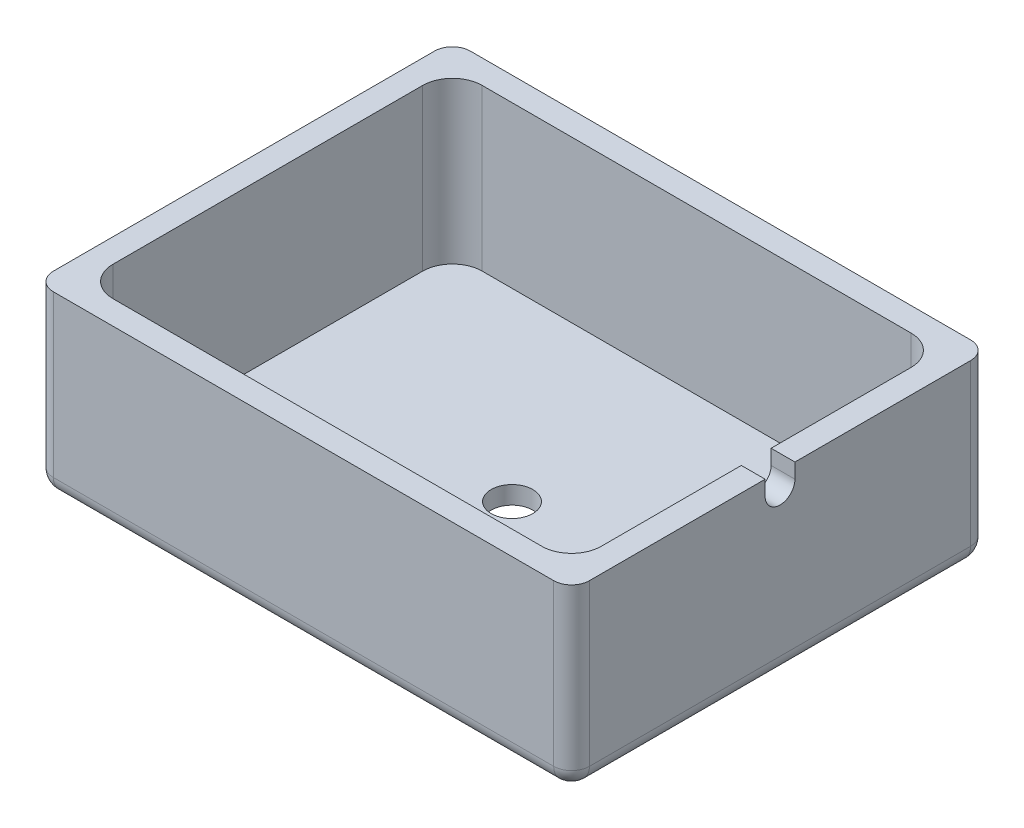
ISO-10303-21;
HEADER;
FILE_DESCRIPTION(('STEP AP214'),'2;1');
FILE_NAME('part.step','',(''),(''),'','','');
FILE_SCHEMA(('AUTOMOTIVE_DESIGN { 1 0 10303 214 1 1 1 1 }'));
ENDSEC;
DATA;
#1=APPLICATION_CONTEXT('core data for automotive mechanical design processes');
#2=APPLICATION_PROTOCOL_DEFINITION('international standard','automotive_design',2000,#1);
#3=PRODUCT_CONTEXT('',#1,'mechanical');
#4=PRODUCT('Part','Part','',(#3));
#5=PRODUCT_RELATED_PRODUCT_CATEGORY('part','',(#4));
#6=PRODUCT_DEFINITION_FORMATION('','',#4);
#7=PRODUCT_DEFINITION_CONTEXT('part definition',#1,'design');
#8=PRODUCT_DEFINITION('design','',#6,#7);
#9=PRODUCT_DEFINITION_SHAPE('','',#8);
#10=(LENGTH_UNIT() NAMED_UNIT(*) SI_UNIT(.MILLI.,.METRE.));
#11=(NAMED_UNIT(*) PLANE_ANGLE_UNIT() SI_UNIT($,.RADIAN.));
#12=(NAMED_UNIT(*) SI_UNIT($,.STERADIAN.) SOLID_ANGLE_UNIT());
#13=UNCERTAINTY_MEASURE_WITH_UNIT(LENGTH_MEASURE(1.E-05),#10,'distance_accuracy_value','');
#14=(GEOMETRIC_REPRESENTATION_CONTEXT(3) GLOBAL_UNCERTAINTY_ASSIGNED_CONTEXT((#13)) GLOBAL_UNIT_ASSIGNED_CONTEXT((#10,
#11,#12)) REPRESENTATION_CONTEXT('',''));
#15=CARTESIAN_POINT('',(0.,0.,0.));
#16=DIRECTION('',(0.,0.,1.));
#17=DIRECTION('',(1.,0.,0.));
#18=AXIS2_PLACEMENT_3D('',#15,#16,#17);
#19=CARTESIAN_POINT('',(45.,3.,0.));
#20=DIRECTION('',(1.,0.,0.));
#21=DIRECTION('',(0.,0.,-1.));
#22=AXIS2_PLACEMENT_3D('',#19,#20,#21);
#23=PLANE('',#22);
#24=DIRECTION('',(0.,1.,0.));
#25=VECTOR('',#24,1.);
#26=CARTESIAN_POINT('',(45.,30.,-2.50000000000001));
#27=LINE('',#26,#25);
#28=CARTESIAN_POINT('',(45.,27.5,-2.50000000000001));
#29=VERTEX_POINT('',#28);
#30=CARTESIAN_POINT('',(45.,30.,-2.50000000000001));
#31=VERTEX_POINT('',#30);
#32=EDGE_CURVE('E217',#29,#31,#27,.T.);
#33=ORIENTED_EDGE('',*,*,#32,.F.);
#34=CARTESIAN_POINT('',(45.,27.5,0.));
#35=DIRECTION('',(1.,0.,0.));
#36=DIRECTION('',(0.,0.,-1.));
#37=AXIS2_PLACEMENT_3D('',#34,#35,#36);
#38=CIRCLE('',#37,2.5);
#39=CARTESIAN_POINT('',(45.,27.5,2.49999999999999));
#40=VERTEX_POINT('',#39);
#41=EDGE_CURVE('E193',#40,#29,#38,.T.);
#42=ORIENTED_EDGE('',*,*,#41,.F.);
#43=DIRECTION('',(0.,-1.,0.));
#44=VECTOR('',#43,1.);
#45=CARTESIAN_POINT('',(45.,27.5,2.49999999999999));
#46=LINE('',#45,#44);
#47=CARTESIAN_POINT('',(45.,30.,2.49999999999999));
#48=VERTEX_POINT('',#47);
#49=EDGE_CURVE('E197',#48,#40,#46,.T.);
#50=ORIENTED_EDGE('',*,*,#49,.F.);
#51=DIRECTION('',(0.,0.,1.));
#52=VECTOR('',#51,1.);
#53=CARTESIAN_POINT('',(45.,30.,0.));
#54=LINE('',#53,#52);
#55=CARTESIAN_POINT('',(45.,30.,32.));
#56=VERTEX_POINT('',#55);
#57=EDGE_CURVE('E229',#48,#56,#54,.T.);
#58=ORIENTED_EDGE('',*,*,#57,.T.);
#59=DIRECTION('',(0.,-1.,0.));
#60=VECTOR('',#59,1.);
#61=CARTESIAN_POINT('',(45.,0.,32.));
#62=LINE('',#61,#60);
#63=CARTESIAN_POINT('',(45.,3.,32.));
#64=VERTEX_POINT('',#63);
#65=EDGE_CURVE('E271',#56,#64,#62,.T.);
#66=ORIENTED_EDGE('',*,*,#65,.T.);
#67=DIRECTION('',(0.,0.,1.));
#68=VECTOR('',#67,1.);
#69=CARTESIAN_POINT('',(45.,3.,-35.));
#70=LINE('',#69,#68);
#71=CARTESIAN_POINT('',(45.,3.,-32.));
#72=VERTEX_POINT('',#71);
#73=EDGE_CURVE('E265',#64,#72,#70,.F.);
#74=ORIENTED_EDGE('',*,*,#73,.T.);
#75=DIRECTION('',(0.,-1.,0.));
#76=VECTOR('',#75,1.);
#77=CARTESIAN_POINT('',(45.,3.,-32.));
#78=LINE('',#77,#76);
#79=CARTESIAN_POINT('',(45.,30.,-32.));
#80=VERTEX_POINT('',#79);
#81=EDGE_CURVE('E269',#72,#80,#78,.F.);
#82=ORIENTED_EDGE('',*,*,#81,.T.);
#83=EDGE_CURVE('E225',#80,#31,#54,.T.);
#84=ORIENTED_EDGE('',*,*,#83,.T.);
#85=EDGE_LOOP('',(#33,#42,#50,#58,#66,#74,#82,#84));
#86=FACE_BOUND('',#85,.T.);
#87=ADVANCED_FACE('F37',(#86),#23,.T.);
#88=CARTESIAN_POINT('',(0.,3.,-35.));
#89=DIRECTION('',(0.,0.,-1.));
#90=DIRECTION('',(-1.,0.,0.));
#91=AXIS2_PLACEMENT_3D('',#88,#89,#90);
#92=PLANE('',#91);
#93=DIRECTION('',(1.,0.,0.));
#94=VECTOR('',#93,1.);
#95=CARTESIAN_POINT('',(0.,30.,-35.));
#96=LINE('',#95,#94);
#97=CARTESIAN_POINT('',(-42.,30.,-35.));
#98=VERTEX_POINT('',#97);
#99=CARTESIAN_POINT('',(42.,30.,-35.));
#100=VERTEX_POINT('',#99);
#101=EDGE_CURVE('E228',#98,#100,#96,.T.);
#102=ORIENTED_EDGE('',*,*,#101,.T.);
#103=DIRECTION('',(0.,-1.,0.));
#104=VECTOR('',#103,1.);
#105=CARTESIAN_POINT('',(42.,3.,-35.));
#106=LINE('',#105,#104);
#107=CARTESIAN_POINT('',(42.,3.,-35.));
#108=VERTEX_POINT('',#107);
#109=EDGE_CURVE('E293',#100,#108,#106,.T.);
#110=ORIENTED_EDGE('',*,*,#109,.T.);
#111=DIRECTION('',(1.,0.,0.));
#112=VECTOR('',#111,1.);
#113=CARTESIAN_POINT('',(-45.,3.,-35.));
#114=LINE('',#113,#112);
#115=CARTESIAN_POINT('',(-42.,3.,-35.));
#116=VERTEX_POINT('',#115);
#117=EDGE_CURVE('E289',#108,#116,#114,.F.);
#118=ORIENTED_EDGE('',*,*,#117,.T.);
#119=DIRECTION('',(0.,-1.,0.));
#120=VECTOR('',#119,1.);
#121=CARTESIAN_POINT('',(-42.,30.,-35.));
#122=LINE('',#121,#120);
#123=EDGE_CURVE('E291',#116,#98,#122,.F.);
#124=ORIENTED_EDGE('',*,*,#123,.T.);
#125=EDGE_LOOP('',(#102,#110,#118,#124));
#126=FACE_BOUND('',#125,.T.);
#127=ADVANCED_FACE('F419',(#126),#92,.T.);
#128=CARTESIAN_POINT('',(-45.,3.,0.));
#129=DIRECTION('',(1.,0.,0.));
#130=DIRECTION('',(0.,0.,-1.));
#131=AXIS2_PLACEMENT_3D('',#128,#129,#130);
#132=PLANE('',#131);
#133=DIRECTION('',(0.,0.,1.));
#134=VECTOR('',#133,1.);
#135=CARTESIAN_POINT('',(-45.,3.,0.));
#136=LINE('',#135,#134);
#137=CARTESIAN_POINT('',(-45.,3.,-32.));
#138=VERTEX_POINT('',#137);
#139=CARTESIAN_POINT('',(-45.,3.,32.));
#140=VERTEX_POINT('',#139);
#141=EDGE_CURVE('E295',#138,#140,#136,.T.);
#142=ORIENTED_EDGE('',*,*,#141,.T.);
#143=DIRECTION('',(0.,-1.,0.));
#144=VECTOR('',#143,1.);
#145=CARTESIAN_POINT('',(-45.,3.,32.));
#146=LINE('',#145,#144);
#147=CARTESIAN_POINT('',(-45.,30.,32.));
#148=VERTEX_POINT('',#147);
#149=EDGE_CURVE('E299',#140,#148,#146,.F.);
#150=ORIENTED_EDGE('',*,*,#149,.T.);
#151=DIRECTION('',(0.,0.,1.));
#152=VECTOR('',#151,1.);
#153=CARTESIAN_POINT('',(-45.,30.,0.));
#154=LINE('',#153,#152);
#155=CARTESIAN_POINT('',(-45.,30.,-32.));
#156=VERTEX_POINT('',#155);
#157=EDGE_CURVE('E232',#156,#148,#154,.T.);
#158=ORIENTED_EDGE('',*,*,#157,.F.);
#159=DIRECTION('',(0.,-1.,0.));
#160=VECTOR('',#159,1.);
#161=CARTESIAN_POINT('',(-45.,0.,-32.));
#162=LINE('',#161,#160);
#163=EDGE_CURVE('E297',#156,#138,#162,.T.);
#164=ORIENTED_EDGE('',*,*,#163,.T.);
#165=EDGE_LOOP('',(#142,#150,#158,#164));
#166=FACE_BOUND('',#165,.T.);
#167=ADVANCED_FACE('F439',(#166),#132,.F.);
#168=CARTESIAN_POINT('',(0.,3.,35.));
#169=DIRECTION('',(0.,0.,-1.));
#170=DIRECTION('',(-1.,0.,0.));
#171=AXIS2_PLACEMENT_3D('',#168,#169,#170);
#172=PLANE('',#171);
#173=DIRECTION('',(1.,0.,0.));
#174=VECTOR('',#173,1.);
#175=CARTESIAN_POINT('',(0.,3.,35.));
#176=LINE('',#175,#174);
#177=CARTESIAN_POINT('',(-42.,3.,35.));
#178=VERTEX_POINT('',#177);
#179=CARTESIAN_POINT('',(42.,3.,35.));
#180=VERTEX_POINT('',#179);
#181=EDGE_CURVE('E274',#178,#180,#176,.T.);
#182=ORIENTED_EDGE('',*,*,#181,.T.);
#183=DIRECTION('',(0.,-1.,0.));
#184=VECTOR('',#183,1.);
#185=CARTESIAN_POINT('',(42.,30.,35.));
#186=LINE('',#185,#184);
#187=CARTESIAN_POINT('',(42.,30.,35.));
#188=VERTEX_POINT('',#187);
#189=EDGE_CURVE('E278',#180,#188,#186,.F.);
#190=ORIENTED_EDGE('',*,*,#189,.T.);
#191=DIRECTION('',(1.,0.,0.));
#192=VECTOR('',#191,1.);
#193=CARTESIAN_POINT('',(0.,30.,35.));
#194=LINE('',#193,#192);
#195=CARTESIAN_POINT('',(-42.,30.,35.));
#196=VERTEX_POINT('',#195);
#197=EDGE_CURVE('E235',#196,#188,#194,.T.);
#198=ORIENTED_EDGE('',*,*,#197,.F.);
#199=DIRECTION('',(0.,-1.,0.));
#200=VECTOR('',#199,1.);
#201=CARTESIAN_POINT('',(-42.,3.,35.));
#202=LINE('',#201,#200);
#203=EDGE_CURVE('E276',#196,#178,#202,.T.);
#204=ORIENTED_EDGE('',*,*,#203,.T.);
#205=EDGE_LOOP('',(#182,#190,#198,#204));
#206=FACE_BOUND('',#205,.T.);
#207=ADVANCED_FACE('F459',(#206),#172,.F.);
#208=CARTESIAN_POINT('',(0.,3.,0.));
#209=DIRECTION('',(0.,-1.,0.));
#210=DIRECTION('',(0.,0.,-1.));
#211=AXIS2_PLACEMENT_3D('',#208,#209,#210);
#212=CYLINDRICAL_SURFACE('',#211,3.5);
#213=CARTESIAN_POINT('',(0.,3.,0.));
#214=DIRECTION('',(0.,1.,0.));
#215=DIRECTION('',(0.,0.,1.));
#216=AXIS2_PLACEMENT_3D('',#213,#214,#215);
#217=CIRCLE('',#216,3.5);
#218=CARTESIAN_POINT('',(0.,3.,3.5));
#219=VERTEX_POINT('',#218);
#220=EDGE_CURVE('E262',#219,#219,#217,.T.);
#221=ORIENTED_EDGE('',*,*,#220,.T.);
#222=EDGE_LOOP('',(#221));
#223=FACE_BOUND('',#222,.T.);
#224=CARTESIAN_POINT('',(0.,0.,0.));
#225=DIRECTION('',(0.,1.,0.));
#226=DIRECTION('',(0.,0.,1.));
#227=AXIS2_PLACEMENT_3D('',#224,#225,#226);
#228=CIRCLE('',#227,3.5);
#229=CARTESIAN_POINT('',(0.,0.,3.5));
#230=VERTEX_POINT('',#229);
#231=EDGE_CURVE('E261',#230,#230,#228,.T.);
#232=ORIENTED_EDGE('',*,*,#231,.F.);
#233=EDGE_LOOP('',(#232));
#234=FACE_BOUND('',#233,.T.);
#235=ADVANCED_FACE('F671',(#223,#234),#212,.F.);
#236=CARTESIAN_POINT('',(0.,3.,0.));
#237=DIRECTION('',(0.,1.,0.));
#238=DIRECTION('',(0.,0.,1.));
#239=AXIS2_PLACEMENT_3D('',#236,#237,#238);
#240=PLANE('',#239);
#241=DIRECTION('',(-1.,0.,0.));
#242=VECTOR('',#241,1.);
#243=CARTESIAN_POINT('',(0.,3.,31.));
#244=LINE('',#243,#242);
#245=CARTESIAN_POINT('',(36.,3.,31.));
#246=VERTEX_POINT('',#245);
#247=CARTESIAN_POINT('',(-36.,3.,31.));
#248=VERTEX_POINT('',#247);
#249=EDGE_CURVE('E249',#246,#248,#244,.T.);
#250=ORIENTED_EDGE('',*,*,#249,.F.);
#251=CARTESIAN_POINT('',(36.,3.,26.));
#252=DIRECTION('',(0.,1.,0.));
#253=DIRECTION('',(0.,0.,1.));
#254=AXIS2_PLACEMENT_3D('',#251,#252,#253);
#255=CIRCLE('',#254,5.);
#256=CARTESIAN_POINT('',(41.,3.,26.));
#257=VERTEX_POINT('',#256);
#258=EDGE_CURVE('E354',#246,#257,#255,.T.);
#259=ORIENTED_EDGE('',*,*,#258,.T.);
#260=DIRECTION('',(0.,0.,-1.));
#261=VECTOR('',#260,1.);
#262=CARTESIAN_POINT('',(41.,3.,0.));
#263=LINE('',#262,#261);
#264=CARTESIAN_POINT('',(41.,3.,-26.));
#265=VERTEX_POINT('',#264);
#266=EDGE_CURVE('E252',#257,#265,#263,.T.);
#267=ORIENTED_EDGE('',*,*,#266,.T.);
#268=CARTESIAN_POINT('',(36.,3.,-26.));
#269=DIRECTION('',(0.,1.,0.));
#270=DIRECTION('',(0.,0.,1.));
#271=AXIS2_PLACEMENT_3D('',#268,#269,#270);
#272=CIRCLE('',#271,5.);
#273=CARTESIAN_POINT('',(36.,3.,-31.));
#274=VERTEX_POINT('',#273);
#275=EDGE_CURVE('E350',#265,#274,#272,.T.);
#276=ORIENTED_EDGE('',*,*,#275,.T.);
#277=DIRECTION('',(-1.,0.,0.));
#278=VECTOR('',#277,1.);
#279=CARTESIAN_POINT('',(0.,3.,-31.));
#280=LINE('',#279,#278);
#281=CARTESIAN_POINT('',(-36.,3.,-31.));
#282=VERTEX_POINT('',#281);
#283=EDGE_CURVE('E255',#274,#282,#280,.T.);
#284=ORIENTED_EDGE('',*,*,#283,.T.);
#285=CARTESIAN_POINT('',(-36.,3.,-26.));
#286=DIRECTION('',(0.,1.,0.));
#287=DIRECTION('',(0.,0.,1.));
#288=AXIS2_PLACEMENT_3D('',#285,#286,#287);
#289=CIRCLE('',#288,5.);
#290=CARTESIAN_POINT('',(-41.,3.,-26.));
#291=VERTEX_POINT('',#290);
#292=EDGE_CURVE('E348',#282,#291,#289,.T.);
#293=ORIENTED_EDGE('',*,*,#292,.T.);
#294=DIRECTION('',(0.,0.,-1.));
#295=VECTOR('',#294,1.);
#296=CARTESIAN_POINT('',(-41.,3.,0.));
#297=LINE('',#296,#295);
#298=CARTESIAN_POINT('',(-41.,3.,26.));
#299=VERTEX_POINT('',#298);
#300=EDGE_CURVE('E258',#299,#291,#297,.T.);
#301=ORIENTED_EDGE('',*,*,#300,.F.);
#302=CARTESIAN_POINT('',(-36.,3.,26.));
#303=DIRECTION('',(0.,1.,0.));
#304=DIRECTION('',(0.,0.,1.));
#305=AXIS2_PLACEMENT_3D('',#302,#303,#304);
#306=CIRCLE('',#305,5.);
#307=EDGE_CURVE('E352',#299,#248,#306,.T.);
#308=ORIENTED_EDGE('',*,*,#307,.T.);
#309=EDGE_LOOP('',(#250,#259,#267,#276,#284,#293,#301,#308));
#310=FACE_BOUND('',#309,.T.);
#311=ORIENTED_EDGE('',*,*,#220,.F.);
#312=EDGE_LOOP('',(#311));
#313=FACE_BOUND('',#312,.T.);
#314=ADVANCED_FACE('F380',(#310,#313),#240,.T.);
#315=CARTESIAN_POINT('',(0.,0.,0.));
#316=DIRECTION('',(0.,1.,0.));
#317=DIRECTION('',(0.,0.,1.));
#318=AXIS2_PLACEMENT_3D('',#315,#316,#317);
#319=PLANE('',#318);
#320=DIRECTION('',(1.,0.,0.));
#321=VECTOR('',#320,1.);
#322=CARTESIAN_POINT('',(45.,0.,-32.));
#323=LINE('',#322,#321);
#324=CARTESIAN_POINT('',(-42.,0.,-32.));
#325=VERTEX_POINT('',#324);
#326=CARTESIAN_POINT('',(42.,0.,-32.));
#327=VERTEX_POINT('',#326);
#328=EDGE_CURVE('E305',#325,#327,#323,.T.);
#329=ORIENTED_EDGE('',*,*,#328,.T.);
#330=DIRECTION('',(0.,0.,1.));
#331=VECTOR('',#330,1.);
#332=CARTESIAN_POINT('',(42.,0.,35.));
#333=LINE('',#332,#331);
#334=CARTESIAN_POINT('',(42.,0.,32.));
#335=VERTEX_POINT('',#334);
#336=EDGE_CURVE('E307',#327,#335,#333,.T.);
#337=ORIENTED_EDGE('',*,*,#336,.T.);
#338=DIRECTION('',(1.,0.,0.));
#339=VECTOR('',#338,1.);
#340=CARTESIAN_POINT('',(0.,0.,32.));
#341=LINE('',#340,#339);
#342=CARTESIAN_POINT('',(-42.,0.,32.));
#343=VERTEX_POINT('',#342);
#344=EDGE_CURVE('E303',#335,#343,#341,.F.);
#345=ORIENTED_EDGE('',*,*,#344,.T.);
#346=DIRECTION('',(0.,0.,1.));
#347=VECTOR('',#346,1.);
#348=CARTESIAN_POINT('',(-42.,0.,0.));
#349=LINE('',#348,#347);
#350=EDGE_CURVE('E301',#343,#325,#349,.F.);
#351=ORIENTED_EDGE('',*,*,#350,.T.);
#352=EDGE_LOOP('',(#329,#337,#345,#351));
#353=FACE_BOUND('',#352,.T.);
#354=ORIENTED_EDGE('',*,*,#231,.T.);
#355=EDGE_LOOP('',(#354));
#356=FACE_BOUND('',#355,.T.);
#357=ADVANCED_FACE('F662',(#353,#356),#319,.F.);
#358=CARTESIAN_POINT('',(-41.,30.,0.));
#359=DIRECTION('',(1.,0.,0.));
#360=DIRECTION('',(0.,0.,-1.));
#361=AXIS2_PLACEMENT_3D('',#358,#359,#360);
#362=PLANE('',#361);
#363=DIRECTION('',(0.,0.,1.));
#364=VECTOR('',#363,1.);
#365=CARTESIAN_POINT('',(-41.,30.,0.));
#366=LINE('',#365,#364);
#367=CARTESIAN_POINT('',(-41.,30.,-26.));
#368=VERTEX_POINT('',#367);
#369=CARTESIAN_POINT('',(-41.,30.,26.));
#370=VERTEX_POINT('',#369);
#371=EDGE_CURVE('E238',#368,#370,#366,.T.);
#372=ORIENTED_EDGE('',*,*,#371,.T.);
#373=DIRECTION('',(0.,-1.,0.));
#374=VECTOR('',#373,1.);
#375=CARTESIAN_POINT('',(-41.,3.,26.));
#376=LINE('',#375,#374);
#377=EDGE_CURVE('E363',#370,#299,#376,.T.);
#378=ORIENTED_EDGE('',*,*,#377,.T.);
#379=ORIENTED_EDGE('',*,*,#300,.T.);
#380=DIRECTION('',(0.,-1.,0.));
#381=VECTOR('',#380,1.);
#382=CARTESIAN_POINT('',(-41.,30.,-26.));
#383=LINE('',#382,#381);
#384=EDGE_CURVE('E361',#291,#368,#383,.F.);
#385=ORIENTED_EDGE('',*,*,#384,.T.);
#386=EDGE_LOOP('',(#372,#378,#379,#385));
#387=FACE_BOUND('',#386,.T.);
#388=ADVANCED_FACE('F388',(#387),#362,.T.);
#389=CARTESIAN_POINT('',(0.,30.,-31.));
#390=DIRECTION('',(0.,0.,-1.));
#391=DIRECTION('',(-1.,0.,0.));
#392=AXIS2_PLACEMENT_3D('',#389,#390,#391);
#393=PLANE('',#392);
#394=ORIENTED_EDGE('',*,*,#283,.F.);
#395=DIRECTION('',(0.,-1.,0.));
#396=VECTOR('',#395,1.);
#397=CARTESIAN_POINT('',(36.,30.,-31.));
#398=LINE('',#397,#396);
#399=CARTESIAN_POINT('',(36.,30.,-31.));
#400=VERTEX_POINT('',#399);
#401=EDGE_CURVE('E52',#274,#400,#398,.F.);
#402=ORIENTED_EDGE('',*,*,#401,.T.);
#403=DIRECTION('',(1.,0.,0.));
#404=VECTOR('',#403,1.);
#405=CARTESIAN_POINT('',(0.,30.,-31.));
#406=LINE('',#405,#404);
#407=CARTESIAN_POINT('',(-36.,30.,-31.));
#408=VERTEX_POINT('',#407);
#409=EDGE_CURVE('E241',#408,#400,#406,.T.);
#410=ORIENTED_EDGE('',*,*,#409,.F.);
#411=DIRECTION('',(0.,-1.,0.));
#412=VECTOR('',#411,1.);
#413=CARTESIAN_POINT('',(-36.,30.,-31.));
#414=LINE('',#413,#412);
#415=EDGE_CURVE('E366',#408,#282,#414,.T.);
#416=ORIENTED_EDGE('',*,*,#415,.T.);
#417=EDGE_LOOP('',(#394,#402,#410,#416));
#418=FACE_BOUND('',#417,.T.);
#419=ADVANCED_FACE('F382',(#418),#393,.F.);
#420=CARTESIAN_POINT('',(41.,30.,0.));
#421=DIRECTION('',(1.,0.,0.));
#422=DIRECTION('',(0.,0.,-1.));
#423=AXIS2_PLACEMENT_3D('',#420,#421,#422);
#424=PLANE('',#423);
#425=ORIENTED_EDGE('',*,*,#266,.F.);
#426=DIRECTION('',(0.,-1.,0.));
#427=VECTOR('',#426,1.);
#428=CARTESIAN_POINT('',(41.,30.,26.));
#429=LINE('',#428,#427);
#430=CARTESIAN_POINT('',(41.,30.,26.));
#431=VERTEX_POINT('',#430);
#432=EDGE_CURVE('E359',#257,#431,#429,.F.);
#433=ORIENTED_EDGE('',*,*,#432,.T.);
#434=DIRECTION('',(0.,0.,1.));
#435=VECTOR('',#434,1.);
#436=CARTESIAN_POINT('',(41.,30.,0.));
#437=LINE('',#436,#435);
#438=CARTESIAN_POINT('',(41.,30.,2.49999999999999));
#439=VERTEX_POINT('',#438);
#440=EDGE_CURVE('E243',#439,#431,#437,.T.);
#441=ORIENTED_EDGE('',*,*,#440,.F.);
#442=DIRECTION('',(0.,1.,0.));
#443=VECTOR('',#442,1.);
#444=CARTESIAN_POINT('',(41.,27.5,2.49999999999999));
#445=LINE('',#444,#443);
#446=CARTESIAN_POINT('',(41.,27.5,2.49999999999999));
#447=VERTEX_POINT('',#446);
#448=EDGE_CURVE('E212',#447,#439,#445,.T.);
#449=ORIENTED_EDGE('',*,*,#448,.F.);
#450=CARTESIAN_POINT('',(41.,27.5,0.));
#451=DIRECTION('',(1.,0.,0.));
#452=DIRECTION('',(0.,0.,-1.));
#453=AXIS2_PLACEMENT_3D('',#450,#451,#452);
#454=CIRCLE('',#453,2.5);
#455=CARTESIAN_POINT('',(41.,27.5,-2.50000000000001));
#456=VERTEX_POINT('',#455);
#457=EDGE_CURVE('E190',#456,#447,#454,.F.);
#458=ORIENTED_EDGE('',*,*,#457,.F.);
#459=DIRECTION('',(0.,-1.,0.));
#460=VECTOR('',#459,1.);
#461=CARTESIAN_POINT('',(41.,30.,-2.50000000000001));
#462=LINE('',#461,#460);
#463=CARTESIAN_POINT('',(41.,30.,-2.50000000000001));
#464=VERTEX_POINT('',#463);
#465=EDGE_CURVE('E201',#464,#456,#462,.T.);
#466=ORIENTED_EDGE('',*,*,#465,.F.);
#467=CARTESIAN_POINT('',(41.,30.,-26.));
#468=VERTEX_POINT('',#467);
#469=EDGE_CURVE('E244',#468,#464,#437,.T.);
#470=ORIENTED_EDGE('',*,*,#469,.F.);
#471=DIRECTION('',(0.,-1.,0.));
#472=VECTOR('',#471,1.);
#473=CARTESIAN_POINT('',(41.,3.,-26.));
#474=LINE('',#473,#472);
#475=EDGE_CURVE('E356',#468,#265,#474,.T.);
#476=ORIENTED_EDGE('',*,*,#475,.T.);
#477=EDGE_LOOP('',(#425,#433,#441,#449,#458,#466,#470,#476));
#478=FACE_BOUND('',#477,.T.);
#479=ADVANCED_FACE('F210',(#478),#424,.F.);
#480=CARTESIAN_POINT('',(0.,30.,31.));
#481=DIRECTION('',(0.,0.,-1.));
#482=DIRECTION('',(-1.,0.,0.));
#483=AXIS2_PLACEMENT_3D('',#480,#481,#482);
#484=PLANE('',#483);
#485=DIRECTION('',(1.,0.,0.));
#486=VECTOR('',#485,1.);
#487=CARTESIAN_POINT('',(0.,30.,31.));
#488=LINE('',#487,#486);
#489=CARTESIAN_POINT('',(-36.,30.,31.));
#490=VERTEX_POINT('',#489);
#491=CARTESIAN_POINT('',(36.,30.,31.));
#492=VERTEX_POINT('',#491);
#493=EDGE_CURVE('E246',#490,#492,#488,.T.);
#494=ORIENTED_EDGE('',*,*,#493,.T.);
#495=DIRECTION('',(0.,-1.,0.));
#496=VECTOR('',#495,1.);
#497=CARTESIAN_POINT('',(36.,30.,31.));
#498=LINE('',#497,#496);
#499=EDGE_CURVE('E345',#492,#246,#498,.T.);
#500=ORIENTED_EDGE('',*,*,#499,.T.);
#501=ORIENTED_EDGE('',*,*,#249,.T.);
#502=DIRECTION('',(0.,-1.,0.));
#503=VECTOR('',#502,1.);
#504=CARTESIAN_POINT('',(-36.,30.,31.));
#505=LINE('',#504,#503);
#506=EDGE_CURVE('E310',#248,#490,#505,.F.);
#507=ORIENTED_EDGE('',*,*,#506,.T.);
#508=EDGE_LOOP('',(#494,#500,#501,#507));
#509=FACE_BOUND('',#508,.T.);
#510=ADVANCED_FACE('F395',(#509),#484,.T.);
#511=CARTESIAN_POINT('',(0.,30.,0.));
#512=DIRECTION('',(0.,1.,0.));
#513=DIRECTION('',(0.,0.,1.));
#514=AXIS2_PLACEMENT_3D('',#511,#512,#513);
#515=PLANE('',#514);
#516=DIRECTION('',(1.,0.,0.));
#517=VECTOR('',#516,1.);
#518=CARTESIAN_POINT('',(-45.001,30.,-2.5));
#519=LINE('',#518,#517);
#520=EDGE_CURVE('E196',#464,#31,#519,.T.);
#521=ORIENTED_EDGE('',*,*,#520,.T.);
#522=ORIENTED_EDGE('',*,*,#83,.F.);
#523=CARTESIAN_POINT('',(42.,30.,-32.));
#524=DIRECTION('',(0.,1.,0.));
#525=DIRECTION('',(0.,0.,1.));
#526=AXIS2_PLACEMENT_3D('',#523,#524,#525);
#527=CIRCLE('',#526,3.);
#528=EDGE_CURVE('E284',#80,#100,#527,.T.);
#529=ORIENTED_EDGE('',*,*,#528,.T.);
#530=ORIENTED_EDGE('',*,*,#101,.F.);
#531=CARTESIAN_POINT('',(-42.,30.,-32.));
#532=DIRECTION('',(0.,1.,0.));
#533=DIRECTION('',(0.,0.,1.));
#534=AXIS2_PLACEMENT_3D('',#531,#532,#533);
#535=CIRCLE('',#534,3.);
#536=EDGE_CURVE('E280',#98,#156,#535,.T.);
#537=ORIENTED_EDGE('',*,*,#536,.T.);
#538=ORIENTED_EDGE('',*,*,#157,.T.);
#539=CARTESIAN_POINT('',(-42.,30.,32.));
#540=DIRECTION('',(0.,1.,0.));
#541=DIRECTION('',(0.,0.,1.));
#542=AXIS2_PLACEMENT_3D('',#539,#540,#541);
#543=CIRCLE('',#542,3.);
#544=EDGE_CURVE('E282',#148,#196,#543,.T.);
#545=ORIENTED_EDGE('',*,*,#544,.T.);
#546=ORIENTED_EDGE('',*,*,#197,.T.);
#547=CARTESIAN_POINT('',(42.,30.,32.));
#548=DIRECTION('',(0.,1.,0.));
#549=DIRECTION('',(0.,0.,1.));
#550=AXIS2_PLACEMENT_3D('',#547,#548,#549);
#551=CIRCLE('',#550,3.);
#552=EDGE_CURVE('E286',#188,#56,#551,.T.);
#553=ORIENTED_EDGE('',*,*,#552,.T.);
#554=ORIENTED_EDGE('',*,*,#57,.F.);
#555=DIRECTION('',(1.,0.,0.));
#556=VECTOR('',#555,1.);
#557=CARTESIAN_POINT('',(-45.001,30.,2.5));
#558=LINE('',#557,#556);
#559=EDGE_CURVE('E222',#439,#48,#558,.T.);
#560=ORIENTED_EDGE('',*,*,#559,.F.);
#561=ORIENTED_EDGE('',*,*,#440,.T.);
#562=CARTESIAN_POINT('',(36.,30.,26.));
#563=DIRECTION('',(0.,1.,0.));
#564=DIRECTION('',(0.,0.,1.));
#565=AXIS2_PLACEMENT_3D('',#562,#563,#564);
#566=CIRCLE('',#565,5.);
#567=EDGE_CURVE('E370',#431,#492,#566,.F.);
#568=ORIENTED_EDGE('',*,*,#567,.T.);
#569=ORIENTED_EDGE('',*,*,#493,.F.);
#570=CARTESIAN_POINT('',(-36.,30.,26.));
#571=DIRECTION('',(0.,1.,0.));
#572=DIRECTION('',(0.,0.,1.));
#573=AXIS2_PLACEMENT_3D('',#570,#571,#572);
#574=CIRCLE('',#573,5.);
#575=EDGE_CURVE('E372',#490,#370,#574,.F.);
#576=ORIENTED_EDGE('',*,*,#575,.T.);
#577=ORIENTED_EDGE('',*,*,#371,.F.);
#578=CARTESIAN_POINT('',(-36.,30.,-26.));
#579=DIRECTION('',(0.,1.,0.));
#580=DIRECTION('',(0.,0.,1.));
#581=AXIS2_PLACEMENT_3D('',#578,#579,#580);
#582=CIRCLE('',#581,5.);
#583=EDGE_CURVE('E11',#368,#408,#582,.F.);
#584=ORIENTED_EDGE('',*,*,#583,.T.);
#585=ORIENTED_EDGE('',*,*,#409,.T.);
#586=CARTESIAN_POINT('',(36.,30.,-26.));
#587=DIRECTION('',(0.,1.,0.));
#588=DIRECTION('',(0.,0.,1.));
#589=AXIS2_PLACEMENT_3D('',#586,#587,#588);
#590=CIRCLE('',#589,5.);
#591=EDGE_CURVE('E45',#400,#468,#590,.F.);
#592=ORIENTED_EDGE('',*,*,#591,.T.);
#593=ORIENTED_EDGE('',*,*,#469,.T.);
#594=EDGE_LOOP('',(#521,#522,#529,#530,#537,#538,#545,#546,#553,#554,#560,#561,#568,#569,#576,
#577,#584,#585,#592,#593));
#595=FACE_BOUND('',#594,.T.);
#596=ADVANCED_FACE('F374',(#595),#515,.T.);
#597=CARTESIAN_POINT('',(-42.,3.,-32.));
#598=DIRECTION('',(0.,1.,0.));
#599=DIRECTION('',(0.,0.,1.));
#600=AXIS2_PLACEMENT_3D('',#597,#598,#599);
#601=CYLINDRICAL_SURFACE('',#600,3.);
#602=CARTESIAN_POINT('',(-42.,3.,-32.));
#603=DIRECTION('',(0.,-1.,0.));
#604=DIRECTION('',(0.,0.,-1.));
#605=AXIS2_PLACEMENT_3D('',#602,#603,#604);
#606=CIRCLE('',#605,3.);
#607=EDGE_CURVE('E341',#138,#116,#606,.T.);
#608=ORIENTED_EDGE('',*,*,#607,.F.);
#609=ORIENTED_EDGE('',*,*,#163,.F.);
#610=ORIENTED_EDGE('',*,*,#536,.F.);
#611=ORIENTED_EDGE('',*,*,#123,.F.);
#612=EDGE_LOOP('',(#608,#609,#610,#611));
#613=FACE_BOUND('',#612,.T.);
#614=ADVANCED_FACE('F434',(#613),#601,.T.);
#615=CARTESIAN_POINT('',(-42.,3.,-32.));
#616=DIRECTION('',(0.,0.,1.));
#617=DIRECTION('',(1.,0.,0.));
#618=AXIS2_PLACEMENT_3D('',#615,#616,#617);
#619=SPHERICAL_SURFACE('',#618,3.);
#620=CARTESIAN_POINT('',(-42.,3.,-32.));
#621=DIRECTION('',(0.,0.,-1.));
#622=DIRECTION('',(-1.,0.,0.));
#623=AXIS2_PLACEMENT_3D('',#620,#621,#622);
#624=CIRCLE('',#623,3.);
#625=EDGE_CURVE('E335',#138,#325,#624,.F.);
#626=ORIENTED_EDGE('',*,*,#625,.F.);
#627=ORIENTED_EDGE('',*,*,#607,.T.);
#628=CARTESIAN_POINT('',(-42.,3.,-32.));
#629=DIRECTION('',(-1.,0.,0.));
#630=DIRECTION('',(0.,-1.,0.));
#631=AXIS2_PLACEMENT_3D('',#628,#629,#630);
#632=CIRCLE('',#631,3.);
#633=EDGE_CURVE('E338',#325,#116,#632,.F.);
#634=ORIENTED_EDGE('',*,*,#633,.F.);
#635=EDGE_LOOP('',(#626,#627,#634));
#636=FACE_BOUND('',#635,.T.);
#637=ADVANCED_FACE('F429',(#636),#619,.T.);
#638=CARTESIAN_POINT('',(42.,3.,-32.));
#639=DIRECTION('',(0.,-1.,0.));
#640=DIRECTION('',(0.,0.,-1.));
#641=AXIS2_PLACEMENT_3D('',#638,#639,#640);
#642=CYLINDRICAL_SURFACE('',#641,3.);
#643=ORIENTED_EDGE('',*,*,#528,.F.);
#644=ORIENTED_EDGE('',*,*,#81,.F.);
#645=CARTESIAN_POINT('',(42.,3.,-32.));
#646=DIRECTION('',(0.,-1.,0.));
#647=DIRECTION('',(0.,0.,-1.));
#648=AXIS2_PLACEMENT_3D('',#645,#646,#647);
#649=CIRCLE('',#648,3.);
#650=EDGE_CURVE('E332',#108,#72,#649,.T.);
#651=ORIENTED_EDGE('',*,*,#650,.F.);
#652=ORIENTED_EDGE('',*,*,#109,.F.);
#653=EDGE_LOOP('',(#643,#644,#651,#652));
#654=FACE_BOUND('',#653,.T.);
#655=ADVANCED_FACE('F415',(#654),#642,.T.);
#656=CARTESIAN_POINT('',(0.,3.,-32.));
#657=DIRECTION('',(-1.,0.,0.));
#658=DIRECTION('',(0.,0.,1.));
#659=AXIS2_PLACEMENT_3D('',#656,#657,#658);
#660=CYLINDRICAL_SURFACE('',#659,3.);
#661=ORIENTED_EDGE('',*,*,#633,.T.);
#662=ORIENTED_EDGE('',*,*,#117,.F.);
#663=CARTESIAN_POINT('',(42.,3.,-32.));
#664=DIRECTION('',(1.,0.,0.));
#665=DIRECTION('',(0.,0.,-1.));
#666=AXIS2_PLACEMENT_3D('',#663,#664,#665);
#667=CIRCLE('',#666,3.);
#668=EDGE_CURVE('E329',#327,#108,#667,.T.);
#669=ORIENTED_EDGE('',*,*,#668,.F.);
#670=ORIENTED_EDGE('',*,*,#328,.F.);
#671=EDGE_LOOP('',(#661,#662,#669,#670));
#672=FACE_BOUND('',#671,.T.);
#673=ADVANCED_FACE('F423',(#672),#660,.T.);
#674=CARTESIAN_POINT('',(-42.,3.,0.));
#675=DIRECTION('',(0.,0.,1.));
#676=DIRECTION('',(1.,0.,0.));
#677=AXIS2_PLACEMENT_3D('',#674,#675,#676);
#678=CYLINDRICAL_SURFACE('',#677,3.);
#679=ORIENTED_EDGE('',*,*,#625,.T.);
#680=ORIENTED_EDGE('',*,*,#350,.F.);
#681=CARTESIAN_POINT('',(-42.,3.,32.));
#682=DIRECTION('',(0.,0.,1.));
#683=DIRECTION('',(1.,0.,0.));
#684=AXIS2_PLACEMENT_3D('',#681,#682,#683);
#685=CIRCLE('',#684,3.);
#686=EDGE_CURVE('E326',#140,#343,#685,.T.);
#687=ORIENTED_EDGE('',*,*,#686,.F.);
#688=ORIENTED_EDGE('',*,*,#141,.F.);
#689=EDGE_LOOP('',(#679,#680,#687,#688));
#690=FACE_BOUND('',#689,.T.);
#691=ADVANCED_FACE('F449',(#690),#678,.T.);
#692=CARTESIAN_POINT('',(-42.,3.,32.));
#693=DIRECTION('',(0.,-1.,0.));
#694=DIRECTION('',(0.,0.,-1.));
#695=AXIS2_PLACEMENT_3D('',#692,#693,#694);
#696=CYLINDRICAL_SURFACE('',#695,3.);
#697=ORIENTED_EDGE('',*,*,#544,.F.);
#698=ORIENTED_EDGE('',*,*,#149,.F.);
#699=CARTESIAN_POINT('',(-42.,3.,32.));
#700=DIRECTION('',(0.,-1.,0.));
#701=DIRECTION('',(0.,0.,-1.));
#702=AXIS2_PLACEMENT_3D('',#699,#700,#701);
#703=CIRCLE('',#702,3.);
#704=EDGE_CURVE('E323',#178,#140,#703,.T.);
#705=ORIENTED_EDGE('',*,*,#704,.F.);
#706=ORIENTED_EDGE('',*,*,#203,.F.);
#707=EDGE_LOOP('',(#697,#698,#705,#706));
#708=FACE_BOUND('',#707,.T.);
#709=ADVANCED_FACE('F444',(#708),#696,.T.);
#710=CARTESIAN_POINT('',(42.,3.,-32.));
#711=DIRECTION('',(0.,0.,1.));
#712=DIRECTION('',(1.,0.,0.));
#713=AXIS2_PLACEMENT_3D('',#710,#711,#712);
#714=SPHERICAL_SURFACE('',#713,3.);
#715=ORIENTED_EDGE('',*,*,#668,.T.);
#716=ORIENTED_EDGE('',*,*,#650,.T.);
#717=CARTESIAN_POINT('',(42.,3.,-32.));
#718=DIRECTION('',(0.,0.,-1.));
#719=DIRECTION('',(-1.,0.,0.));
#720=AXIS2_PLACEMENT_3D('',#717,#718,#719);
#721=CIRCLE('',#720,3.);
#722=EDGE_CURVE('E320',#327,#72,#721,.F.);
#723=ORIENTED_EDGE('',*,*,#722,.F.);
#724=EDGE_LOOP('',(#715,#716,#723));
#725=FACE_BOUND('',#724,.T.);
#726=ADVANCED_FACE('F472',(#725),#714,.T.);
#727=CARTESIAN_POINT('',(-42.,3.,32.));
#728=DIRECTION('',(0.,0.,1.));
#729=DIRECTION('',(1.,0.,0.));
#730=AXIS2_PLACEMENT_3D('',#727,#728,#729);
#731=SPHERICAL_SURFACE('',#730,3.);
#732=ORIENTED_EDGE('',*,*,#704,.T.);
#733=ORIENTED_EDGE('',*,*,#686,.T.);
#734=CARTESIAN_POINT('',(-42.,3.,32.));
#735=DIRECTION('',(-1.,0.,0.));
#736=DIRECTION('',(0.,0.,1.));
#737=AXIS2_PLACEMENT_3D('',#734,#735,#736);
#738=CIRCLE('',#737,3.);
#739=EDGE_CURVE('E317',#178,#343,#738,.F.);
#740=ORIENTED_EDGE('',*,*,#739,.F.);
#741=EDGE_LOOP('',(#732,#733,#740));
#742=FACE_BOUND('',#741,.T.);
#743=ADVANCED_FACE('F451',(#742),#731,.T.);
#744=CARTESIAN_POINT('',(42.,3.,0.));
#745=DIRECTION('',(0.,0.,-1.));
#746=DIRECTION('',(-1.,0.,0.));
#747=AXIS2_PLACEMENT_3D('',#744,#745,#746);
#748=CYLINDRICAL_SURFACE('',#747,3.);
#749=ORIENTED_EDGE('',*,*,#722,.T.);
#750=ORIENTED_EDGE('',*,*,#73,.F.);
#751=CARTESIAN_POINT('',(42.,3.,32.));
#752=DIRECTION('',(0.,0.,1.));
#753=DIRECTION('',(1.,0.,0.));
#754=AXIS2_PLACEMENT_3D('',#751,#752,#753);
#755=CIRCLE('',#754,3.);
#756=EDGE_CURVE('E314',#335,#64,#755,.T.);
#757=ORIENTED_EDGE('',*,*,#756,.F.);
#758=ORIENTED_EDGE('',*,*,#336,.F.);
#759=EDGE_LOOP('',(#749,#750,#757,#758));
#760=FACE_BOUND('',#759,.T.);
#761=ADVANCED_FACE('F469',(#760),#748,.T.);
#762=CARTESIAN_POINT('',(0.,3.,32.));
#763=DIRECTION('',(1.,0.,0.));
#764=DIRECTION('',(0.,0.,-1.));
#765=AXIS2_PLACEMENT_3D('',#762,#763,#764);
#766=CYLINDRICAL_SURFACE('',#765,3.);
#767=ORIENTED_EDGE('',*,*,#739,.T.);
#768=ORIENTED_EDGE('',*,*,#344,.F.);
#769=CARTESIAN_POINT('',(42.,3.,32.));
#770=DIRECTION('',(1.,0.,0.));
#771=DIRECTION('',(0.,0.,-1.));
#772=AXIS2_PLACEMENT_3D('',#769,#770,#771);
#773=CIRCLE('',#772,3.);
#774=EDGE_CURVE('E312',#180,#335,#773,.T.);
#775=ORIENTED_EDGE('',*,*,#774,.F.);
#776=ORIENTED_EDGE('',*,*,#181,.F.);
#777=EDGE_LOOP('',(#767,#768,#775,#776));
#778=FACE_BOUND('',#777,.T.);
#779=ADVANCED_FACE('F456',(#778),#766,.T.);
#780=CARTESIAN_POINT('',(42.,3.,32.));
#781=DIRECTION('',(0.,0.,1.));
#782=DIRECTION('',(1.,0.,0.));
#783=AXIS2_PLACEMENT_3D('',#780,#781,#782);
#784=SPHERICAL_SURFACE('',#783,3.);
#785=ORIENTED_EDGE('',*,*,#774,.T.);
#786=ORIENTED_EDGE('',*,*,#756,.T.);
#787=CARTESIAN_POINT('',(42.,3.,32.));
#788=DIRECTION('',(0.,-1.,0.));
#789=DIRECTION('',(0.,0.,-1.));
#790=AXIS2_PLACEMENT_3D('',#787,#788,#789);
#791=CIRCLE('',#790,3.);
#792=EDGE_CURVE('E206',#180,#64,#791,.F.);
#793=ORIENTED_EDGE('',*,*,#792,.F.);
#794=EDGE_LOOP('',(#785,#786,#793));
#795=FACE_BOUND('',#794,.T.);
#796=ADVANCED_FACE('F491',(#795),#784,.T.);
#797=CARTESIAN_POINT('',(42.,3.,32.));
#798=DIRECTION('',(0.,1.,0.));
#799=DIRECTION('',(0.,0.,1.));
#800=AXIS2_PLACEMENT_3D('',#797,#798,#799);
#801=CYLINDRICAL_SURFACE('',#800,3.);
#802=ORIENTED_EDGE('',*,*,#552,.F.);
#803=ORIENTED_EDGE('',*,*,#189,.F.);
#804=ORIENTED_EDGE('',*,*,#792,.T.);
#805=ORIENTED_EDGE('',*,*,#65,.F.);
#806=EDGE_LOOP('',(#802,#803,#804,#805));
#807=FACE_BOUND('',#806,.T.);
#808=ADVANCED_FACE('F464',(#807),#801,.T.);
#809=CARTESIAN_POINT('',(-45.001,30.,-2.5));
#810=DIRECTION('',(0.,0.,-1.));
#811=DIRECTION('',(0.,1.,0.));
#812=AXIS2_PLACEMENT_3D('',#809,#810,#811);
#813=PLANE('',#812);
#814=ORIENTED_EDGE('',*,*,#465,.T.);
#815=DIRECTION('',(1.,0.,0.));
#816=VECTOR('',#815,1.);
#817=CARTESIAN_POINT('',(-45.001,27.5,-2.5));
#818=LINE('',#817,#816);
#819=EDGE_CURVE('E186',#456,#29,#818,.T.);
#820=ORIENTED_EDGE('',*,*,#819,.T.);
#821=ORIENTED_EDGE('',*,*,#32,.T.);
#822=ORIENTED_EDGE('',*,*,#520,.F.);
#823=EDGE_LOOP('',(#814,#820,#821,#822));
#824=FACE_BOUND('',#823,.T.);
#825=ADVANCED_FACE('F202',(#824),#813,.F.);
#826=CARTESIAN_POINT('',(-45.001,27.5,2.5));
#827=DIRECTION('',(0.,0.,1.));
#828=DIRECTION('',(0.,-1.,0.));
#829=AXIS2_PLACEMENT_3D('',#826,#827,#828);
#830=PLANE('',#829);
#831=ORIENTED_EDGE('',*,*,#448,.T.);
#832=ORIENTED_EDGE('',*,*,#559,.T.);
#833=ORIENTED_EDGE('',*,*,#49,.T.);
#834=DIRECTION('',(1.,0.,0.));
#835=VECTOR('',#834,1.);
#836=CARTESIAN_POINT('',(-45.001,27.5,2.5));
#837=LINE('',#836,#835);
#838=EDGE_CURVE('E207',#447,#40,#837,.T.);
#839=ORIENTED_EDGE('',*,*,#838,.F.);
#840=EDGE_LOOP('',(#831,#832,#833,#839));
#841=FACE_BOUND('',#840,.T.);
#842=ADVANCED_FACE('F407',(#841),#830,.F.);
#843=CARTESIAN_POINT('',(-45.001,27.5,0.));
#844=DIRECTION('',(1.,0.,0.));
#845=DIRECTION('',(0.,0.,-1.));
#846=AXIS2_PLACEMENT_3D('',#843,#844,#845);
#847=CYLINDRICAL_SURFACE('',#846,2.5);
#848=ORIENTED_EDGE('',*,*,#457,.T.);
#849=ORIENTED_EDGE('',*,*,#838,.T.);
#850=ORIENTED_EDGE('',*,*,#41,.T.);
#851=ORIENTED_EDGE('',*,*,#819,.F.);
#852=EDGE_LOOP('',(#848,#849,#850,#851));
#853=FACE_BOUND('',#852,.T.);
#854=ADVANCED_FACE('F188',(#853),#847,.F.);
#855=CARTESIAN_POINT('',(36.,30.,26.));
#856=DIRECTION('',(0.,-1.,0.));
#857=DIRECTION('',(0.,0.,-1.));
#858=AXIS2_PLACEMENT_3D('',#855,#856,#857);
#859=CYLINDRICAL_SURFACE('',#858,5.);
#860=ORIENTED_EDGE('',*,*,#567,.F.);
#861=ORIENTED_EDGE('',*,*,#432,.F.);
#862=ORIENTED_EDGE('',*,*,#258,.F.);
#863=ORIENTED_EDGE('',*,*,#499,.F.);
#864=EDGE_LOOP('',(#860,#861,#862,#863));
#865=FACE_BOUND('',#864,.T.);
#866=ADVANCED_FACE('F400',(#865),#859,.F.);
#867=CARTESIAN_POINT('',(-36.,30.,26.));
#868=DIRECTION('',(0.,1.,0.));
#869=DIRECTION('',(0.,0.,1.));
#870=AXIS2_PLACEMENT_3D('',#867,#868,#869);
#871=CYLINDRICAL_SURFACE('',#870,5.);
#872=ORIENTED_EDGE('',*,*,#575,.F.);
#873=ORIENTED_EDGE('',*,*,#506,.F.);
#874=ORIENTED_EDGE('',*,*,#307,.F.);
#875=ORIENTED_EDGE('',*,*,#377,.F.);
#876=EDGE_LOOP('',(#872,#873,#874,#875));
#877=FACE_BOUND('',#876,.T.);
#878=ADVANCED_FACE('F392',(#877),#871,.F.);
#879=CARTESIAN_POINT('',(36.,30.,-26.));
#880=DIRECTION('',(0.,1.,0.));
#881=DIRECTION('',(0.,0.,1.));
#882=AXIS2_PLACEMENT_3D('',#879,#880,#881);
#883=CYLINDRICAL_SURFACE('',#882,5.);
#884=ORIENTED_EDGE('',*,*,#591,.F.);
#885=ORIENTED_EDGE('',*,*,#401,.F.);
#886=ORIENTED_EDGE('',*,*,#275,.F.);
#887=ORIENTED_EDGE('',*,*,#475,.F.);
#888=EDGE_LOOP('',(#884,#885,#886,#887));
#889=FACE_BOUND('',#888,.T.);
#890=ADVANCED_FACE('F377',(#889),#883,.F.);
#891=CARTESIAN_POINT('',(-36.,30.,-26.));
#892=DIRECTION('',(0.,-1.,0.));
#893=DIRECTION('',(0.,0.,-1.));
#894=AXIS2_PLACEMENT_3D('',#891,#892,#893);
#895=CYLINDRICAL_SURFACE('',#894,5.);
#896=ORIENTED_EDGE('',*,*,#583,.F.);
#897=ORIENTED_EDGE('',*,*,#384,.F.);
#898=ORIENTED_EDGE('',*,*,#292,.F.);
#899=ORIENTED_EDGE('',*,*,#415,.F.);
#900=EDGE_LOOP('',(#896,#897,#898,#899));
#901=FACE_BOUND('',#900,.T.);
#902=ADVANCED_FACE('F39',(#901),#895,.F.);
#903=CLOSED_SHELL('',(#87,#127,#167,#207,#235,#314,#357,#388,#419,#479,#510,#596,#614,#637,#655,
#673,#691,#709,#726,#743,#761,#779,#796,#808,#825,#842,#854,#866,#878,#890,#902));
#904=MANIFOLD_SOLID_BREP('B2',#903);
#905=ADVANCED_BREP_SHAPE_REPRESENTATION('',(#18,#904),#14);
#906=SHAPE_DEFINITION_REPRESENTATION(#9,#905);
ENDSEC;
END-ISO-10303-21;
